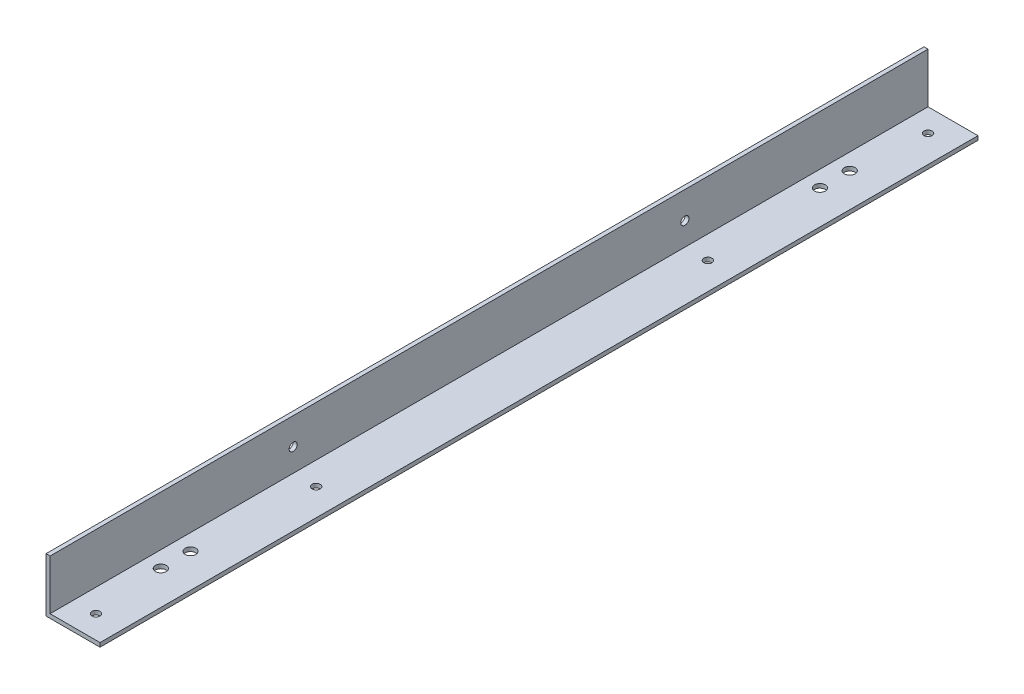
ISO-10303-21;
HEADER;
FILE_DESCRIPTION(('STEP AP214'),'2;1');
FILE_NAME('part.step','',(''),(''),'','','');
FILE_SCHEMA(('AUTOMOTIVE_DESIGN { 1 0 10303 214 1 1 1 1 }'));
ENDSEC;
DATA;
#1=APPLICATION_CONTEXT('core data for automotive mechanical design processes');
#2=APPLICATION_PROTOCOL_DEFINITION('international standard','automotive_design',2000,#1);
#3=PRODUCT_CONTEXT('',#1,'mechanical');
#4=PRODUCT('Part','Part','',(#3));
#5=PRODUCT_RELATED_PRODUCT_CATEGORY('part','',(#4));
#6=PRODUCT_DEFINITION_FORMATION('','',#4);
#7=PRODUCT_DEFINITION_CONTEXT('part definition',#1,'design');
#8=PRODUCT_DEFINITION('design','',#6,#7);
#9=PRODUCT_DEFINITION_SHAPE('','',#8);
#10=(LENGTH_UNIT() NAMED_UNIT(*) SI_UNIT(.MILLI.,.METRE.));
#11=(NAMED_UNIT(*) PLANE_ANGLE_UNIT() SI_UNIT($,.RADIAN.));
#12=(NAMED_UNIT(*) SI_UNIT($,.STERADIAN.) SOLID_ANGLE_UNIT());
#13=UNCERTAINTY_MEASURE_WITH_UNIT(LENGTH_MEASURE(1.E-05),#10,'distance_accuracy_value','');
#14=(GEOMETRIC_REPRESENTATION_CONTEXT(3) GLOBAL_UNCERTAINTY_ASSIGNED_CONTEXT((#13)) GLOBAL_UNIT_ASSIGNED_CONTEXT((#10,
#11,#12)) REPRESENTATION_CONTEXT('',''));
#15=CARTESIAN_POINT('',(0.,0.,0.));
#16=DIRECTION('',(0.,0.,1.));
#17=DIRECTION('',(1.,0.,0.));
#18=AXIS2_PLACEMENT_3D('',#15,#16,#17);
#19=CARTESIAN_POINT('',(-15.9316863798358,4.77336842105263,325.));
#20=DIRECTION('',(0.,-1.,0.));
#21=DIRECTION('',(1.,0.,0.));
#22=AXIS2_PLACEMENT_3D('',#19,#20,#21);
#23=PLANE('',#22);
#24=DIRECTION('',(-1.,0.,0.));
#25=VECTOR('',#24,1.);
#26=CARTESIAN_POINT('',(-15.9316863798358,4.77336842105263,0.));
#27=LINE('',#26,#25);
#28=CARTESIAN_POINT('',(-15.9316863798358,4.77336842105263,0.));
#29=VERTEX_POINT('',#28);
#30=CARTESIAN_POINT('',(-17.4316863798358,4.77336842105263,0.));
#31=VERTEX_POINT('',#30);
#32=EDGE_CURVE('E116',#29,#31,#27,.T.);
#33=ORIENTED_EDGE('',*,*,#32,.T.);
#34=DIRECTION('',(0.,0.,-1.));
#35=VECTOR('',#34,1.);
#36=CARTESIAN_POINT('',(-17.4316863798358,4.77336842105263,325.));
#37=LINE('',#36,#35);
#38=CARTESIAN_POINT('',(-17.4316863798358,4.77336842105263,325.));
#39=VERTEX_POINT('',#38);
#40=EDGE_CURVE('E11',#39,#31,#37,.T.);
#41=ORIENTED_EDGE('',*,*,#40,.F.);
#42=DIRECTION('',(-1.,0.,0.));
#43=VECTOR('',#42,1.);
#44=CARTESIAN_POINT('',(-15.9316863798358,4.77336842105263,325.));
#45=LINE('',#44,#43);
#46=CARTESIAN_POINT('',(-15.9316863798358,4.77336842105263,325.));
#47=VERTEX_POINT('',#46);
#48=EDGE_CURVE('E127',#47,#39,#45,.T.);
#49=ORIENTED_EDGE('',*,*,#48,.F.);
#50=DIRECTION('',(0.,0.,-1.));
#51=VECTOR('',#50,1.);
#52=CARTESIAN_POINT('',(-15.9316863798358,4.77336842105263,325.));
#53=LINE('',#52,#51);
#54=EDGE_CURVE('E112',#47,#29,#53,.T.);
#55=ORIENTED_EDGE('',*,*,#54,.T.);
#56=EDGE_LOOP('',(#33,#41,#49,#55));
#57=FACE_BOUND('',#56,.T.);
#58=ADVANCED_FACE('F30',(#57),#23,.F.);
#59=CARTESIAN_POINT('',(-17.4316863798358,4.77336842105263,325.));
#60=DIRECTION('',(1.,0.,0.));
#61=DIRECTION('',(0.,1.,0.));
#62=AXIS2_PLACEMENT_3D('',#59,#60,#61);
#63=PLANE('',#62);
#64=CARTESIAN_POINT('',(-17.4316863798358,-5.22663157894737,90.));
#65=DIRECTION('',(-1.,0.,0.));
#66=DIRECTION('',(0.,-1.,0.));
#67=AXIS2_PLACEMENT_3D('',#64,#65,#66);
#68=CIRCLE('',#67,1.5);
#69=CARTESIAN_POINT('',(-17.4316863798358,-6.72663157894736,90.));
#70=VERTEX_POINT('',#69);
#71=EDGE_CURVE('E146',#70,#70,#68,.T.);
#72=ORIENTED_EDGE('',*,*,#71,.F.);
#73=EDGE_LOOP('',(#72));
#74=FACE_BOUND('',#73,.T.);
#75=CARTESIAN_POINT('',(-17.4316863798358,-5.22663157894737,235.));
#76=DIRECTION('',(-1.,0.,0.));
#77=DIRECTION('',(0.,-1.,0.));
#78=AXIS2_PLACEMENT_3D('',#75,#76,#77);
#79=CIRCLE('',#78,1.5);
#80=CARTESIAN_POINT('',(-17.4316863798358,-6.72663157894736,235.));
#81=VERTEX_POINT('',#80);
#82=EDGE_CURVE('E135',#81,#81,#79,.T.);
#83=ORIENTED_EDGE('',*,*,#82,.F.);
#84=EDGE_LOOP('',(#83));
#85=FACE_BOUND('',#84,.T.);
#86=DIRECTION('',(0.,-1.,0.));
#87=VECTOR('',#86,1.);
#88=CARTESIAN_POINT('',(-17.4316863798358,4.77336842105263,0.));
#89=LINE('',#88,#87);
#90=CARTESIAN_POINT('',(-17.4316863798357,-15.2266315789474,0.));
#91=VERTEX_POINT('',#90);
#92=EDGE_CURVE('E119',#31,#91,#89,.T.);
#93=ORIENTED_EDGE('',*,*,#92,.T.);
#94=DIRECTION('',(0.,0.,-1.));
#95=VECTOR('',#94,1.);
#96=CARTESIAN_POINT('',(-17.4316863798357,-15.2266315789474,325.));
#97=LINE('',#96,#95);
#98=CARTESIAN_POINT('',(-17.4316863798357,-15.2266315789474,325.));
#99=VERTEX_POINT('',#98);
#100=EDGE_CURVE('E39',#99,#91,#97,.T.);
#101=ORIENTED_EDGE('',*,*,#100,.F.);
#102=DIRECTION('',(0.,-1.,0.));
#103=VECTOR('',#102,1.);
#104=CARTESIAN_POINT('',(-17.4316863798358,4.77336842105263,325.));
#105=LINE('',#104,#103);
#106=EDGE_CURVE('E85',#39,#99,#105,.T.);
#107=ORIENTED_EDGE('',*,*,#106,.F.);
#108=ORIENTED_EDGE('',*,*,#40,.T.);
#109=EDGE_LOOP('',(#93,#101,#107,#108));
#110=FACE_BOUND('',#109,.T.);
#111=ADVANCED_FACE('F195',(#74,#85,#110),#63,.F.);
#112=CARTESIAN_POINT('',(-17.4316863798357,-15.2266315789474,325.));
#113=DIRECTION('',(0.,1.,0.));
#114=DIRECTION('',(0.,0.,1.));
#115=AXIS2_PLACEMENT_3D('',#112,#113,#114);
#116=PLANE('',#115);
#117=CARTESIAN_POINT('',(-7.43168637983575,-15.2266315789474,90.));
#118=DIRECTION('',(0.,1.,0.));
#119=DIRECTION('',(0.,0.,1.));
#120=AXIS2_PLACEMENT_3D('',#117,#118,#119);
#121=CIRCLE('',#120,1.5);
#122=CARTESIAN_POINT('',(-7.43168637983575,-15.2266315789474,91.5));
#123=VERTEX_POINT('',#122);
#124=EDGE_CURVE('E139',#123,#123,#121,.T.);
#125=ORIENTED_EDGE('',*,*,#124,.T.);
#126=EDGE_LOOP('',(#125));
#127=FACE_BOUND('',#126,.T.);
#128=CARTESIAN_POINT('',(-7.43168637983575,-15.2266315789474,235.));
#129=DIRECTION('',(0.,1.,0.));
#130=DIRECTION('',(0.,0.,1.));
#131=AXIS2_PLACEMENT_3D('',#128,#129,#130);
#132=CIRCLE('',#131,1.5);
#133=CARTESIAN_POINT('',(-7.43168637983575,-15.2266315789474,236.5));
#134=VERTEX_POINT('',#133);
#135=EDGE_CURVE('E154',#134,#134,#132,.T.);
#136=ORIENTED_EDGE('',*,*,#135,.T.);
#137=EDGE_LOOP('',(#136));
#138=FACE_BOUND('',#137,.T.);
#139=CARTESIAN_POINT('',(-9.93168637983575,-15.2266315789474,279.));
#140=DIRECTION('',(0.,1.,0.));
#141=DIRECTION('',(0.,0.,1.));
#142=AXIS2_PLACEMENT_3D('',#139,#140,#141);
#143=CIRCLE('',#142,2.);
#144=CARTESIAN_POINT('',(-9.93168637983575,-15.2266315789474,281.));
#145=VERTEX_POINT('',#144);
#146=EDGE_CURVE('E160',#145,#145,#143,.T.);
#147=ORIENTED_EDGE('',*,*,#146,.T.);
#148=EDGE_LOOP('',(#147));
#149=FACE_BOUND('',#148,.T.);
#150=CARTESIAN_POINT('',(-9.93168637983575,-15.2266315789474,290.));
#151=DIRECTION('',(0.,1.,0.));
#152=DIRECTION('',(0.,0.,1.));
#153=AXIS2_PLACEMENT_3D('',#150,#151,#152);
#154=CIRCLE('',#153,2.);
#155=CARTESIAN_POINT('',(-9.93168637983575,-15.2266315789474,292.));
#156=VERTEX_POINT('',#155);
#157=EDGE_CURVE('E166',#156,#156,#154,.T.);
#158=ORIENTED_EDGE('',*,*,#157,.T.);
#159=EDGE_LOOP('',(#158));
#160=FACE_BOUND('',#159,.T.);
#161=CARTESIAN_POINT('',(-9.93168637983575,-15.2266315789474,46.));
#162=DIRECTION('',(0.,1.,0.));
#163=DIRECTION('',(0.,0.,1.));
#164=AXIS2_PLACEMENT_3D('',#161,#162,#163);
#165=CIRCLE('',#164,2.);
#166=CARTESIAN_POINT('',(-9.93168637983575,-15.2266315789474,48.));
#167=VERTEX_POINT('',#166);
#168=EDGE_CURVE('E172',#167,#167,#165,.T.);
#169=ORIENTED_EDGE('',*,*,#168,.T.);
#170=EDGE_LOOP('',(#169));
#171=FACE_BOUND('',#170,.T.);
#172=CARTESIAN_POINT('',(-9.93168637983575,-15.2266315789474,35.));
#173=DIRECTION('',(0.,1.,0.));
#174=DIRECTION('',(0.,0.,1.));
#175=AXIS2_PLACEMENT_3D('',#172,#173,#174);
#176=CIRCLE('',#175,2.);
#177=CARTESIAN_POINT('',(-9.93168637983575,-15.2266315789474,37.));
#178=VERTEX_POINT('',#177);
#179=EDGE_CURVE('E178',#178,#178,#176,.T.);
#180=ORIENTED_EDGE('',*,*,#179,.T.);
#181=EDGE_LOOP('',(#180));
#182=FACE_BOUND('',#181,.T.);
#183=CARTESIAN_POINT('',(-7.43168637983575,-15.2266315789474,316.5));
#184=DIRECTION('',(0.,1.,0.));
#185=DIRECTION('',(0.,0.,1.));
#186=AXIS2_PLACEMENT_3D('',#183,#184,#185);
#187=CIRCLE('',#186,1.5);
#188=CARTESIAN_POINT('',(-7.43168637983575,-15.2266315789474,318.));
#189=VERTEX_POINT('',#188);
#190=EDGE_CURVE('E184',#189,#189,#187,.T.);
#191=ORIENTED_EDGE('',*,*,#190,.T.);
#192=EDGE_LOOP('',(#191));
#193=FACE_BOUND('',#192,.T.);
#194=CARTESIAN_POINT('',(-7.43168637983575,-15.2266315789474,8.50000000000001));
#195=DIRECTION('',(0.,1.,0.));
#196=DIRECTION('',(0.,0.,1.));
#197=AXIS2_PLACEMENT_3D('',#194,#195,#196);
#198=CIRCLE('',#197,1.5);
#199=CARTESIAN_POINT('',(-7.43168637983575,-15.2266315789474,10.));
#200=VERTEX_POINT('',#199);
#201=EDGE_CURVE('E120',#200,#200,#198,.T.);
#202=ORIENTED_EDGE('',*,*,#201,.T.);
#203=EDGE_LOOP('',(#202));
#204=FACE_BOUND('',#203,.T.);
#205=DIRECTION('',(1.,0.,0.));
#206=VECTOR('',#205,1.);
#207=CARTESIAN_POINT('',(-17.4316863798357,-15.2266315789474,0.));
#208=LINE('',#207,#206);
#209=CARTESIAN_POINT('',(2.56831362016425,-15.2266315789474,0.));
#210=VERTEX_POINT('',#209);
#211=EDGE_CURVE('E122',#91,#210,#208,.T.);
#212=ORIENTED_EDGE('',*,*,#211,.T.);
#213=DIRECTION('',(0.,0.,-1.));
#214=VECTOR('',#213,1.);
#215=CARTESIAN_POINT('',(2.56831362016425,-15.2266315789474,325.));
#216=LINE('',#215,#214);
#217=CARTESIAN_POINT('',(2.56831362016425,-15.2266315789474,325.));
#218=VERTEX_POINT('',#217);
#219=EDGE_CURVE('E107',#218,#210,#216,.T.);
#220=ORIENTED_EDGE('',*,*,#219,.F.);
#221=DIRECTION('',(1.,0.,0.));
#222=VECTOR('',#221,1.);
#223=CARTESIAN_POINT('',(-17.4316863798357,-15.2266315789474,325.));
#224=LINE('',#223,#222);
#225=EDGE_CURVE('E98',#99,#218,#224,.T.);
#226=ORIENTED_EDGE('',*,*,#225,.F.);
#227=ORIENTED_EDGE('',*,*,#100,.T.);
#228=EDGE_LOOP('',(#212,#220,#226,#227));
#229=FACE_BOUND('',#228,.T.);
#230=ADVANCED_FACE('F198',(#127,#138,#149,#160,#171,#182,#193,#204,#229),#116,.F.);
#231=CARTESIAN_POINT('',(2.56831362016425,-15.2266315789474,325.));
#232=DIRECTION('',(-1.,0.,0.));
#233=DIRECTION('',(0.,0.,1.));
#234=AXIS2_PLACEMENT_3D('',#231,#232,#233);
#235=PLANE('',#234);
#236=DIRECTION('',(0.,1.,0.));
#237=VECTOR('',#236,1.);
#238=CARTESIAN_POINT('',(2.56831362016425,-15.2266315789474,0.));
#239=LINE('',#238,#237);
#240=CARTESIAN_POINT('',(2.56831362016425,-13.7266315789474,0.));
#241=VERTEX_POINT('',#240);
#242=EDGE_CURVE('E106',#210,#241,#239,.T.);
#243=ORIENTED_EDGE('',*,*,#242,.T.);
#244=DIRECTION('',(0.,0.,-1.));
#245=VECTOR('',#244,1.);
#246=CARTESIAN_POINT('',(2.56831362016425,-13.7266315789474,325.));
#247=LINE('',#246,#245);
#248=CARTESIAN_POINT('',(2.56831362016425,-13.7266315789474,325.));
#249=VERTEX_POINT('',#248);
#250=EDGE_CURVE('E103',#249,#241,#247,.T.);
#251=ORIENTED_EDGE('',*,*,#250,.F.);
#252=DIRECTION('',(0.,1.,0.));
#253=VECTOR('',#252,1.);
#254=CARTESIAN_POINT('',(2.56831362016425,-15.2266315789474,325.));
#255=LINE('',#254,#253);
#256=EDGE_CURVE('E92',#218,#249,#255,.T.);
#257=ORIENTED_EDGE('',*,*,#256,.F.);
#258=ORIENTED_EDGE('',*,*,#219,.T.);
#259=EDGE_LOOP('',(#243,#251,#257,#258));
#260=FACE_BOUND('',#259,.T.);
#261=ADVANCED_FACE('F104',(#260),#235,.F.);
#262=CARTESIAN_POINT('',(2.56831362016425,-13.7266315789474,325.));
#263=DIRECTION('',(0.,-1.,0.));
#264=DIRECTION('',(1.,0.,0.));
#265=AXIS2_PLACEMENT_3D('',#262,#263,#264);
#266=PLANE('',#265);
#267=CARTESIAN_POINT('',(-7.43168637983575,-13.7266315789474,90.));
#268=DIRECTION('',(0.,1.,0.));
#269=DIRECTION('',(-1.,0.,0.));
#270=AXIS2_PLACEMENT_3D('',#267,#268,#269);
#271=CIRCLE('',#270,1.5);
#272=CARTESIAN_POINT('',(-8.93168637983575,-13.7266315789474,90.));
#273=VERTEX_POINT('',#272);
#274=EDGE_CURVE('E134',#273,#273,#271,.T.);
#275=ORIENTED_EDGE('',*,*,#274,.F.);
#276=EDGE_LOOP('',(#275));
#277=FACE_BOUND('',#276,.T.);
#278=CARTESIAN_POINT('',(-7.43168637983575,-13.7266315789474,235.));
#279=DIRECTION('',(0.,1.,0.));
#280=DIRECTION('',(-1.,0.,0.));
#281=AXIS2_PLACEMENT_3D('',#278,#279,#280);
#282=CIRCLE('',#281,1.5);
#283=CARTESIAN_POINT('',(-8.93168637983575,-13.7266315789474,235.));
#284=VERTEX_POINT('',#283);
#285=EDGE_CURVE('E151',#284,#284,#282,.T.);
#286=ORIENTED_EDGE('',*,*,#285,.F.);
#287=EDGE_LOOP('',(#286));
#288=FACE_BOUND('',#287,.T.);
#289=CARTESIAN_POINT('',(-9.93168637983575,-13.7266315789474,279.));
#290=DIRECTION('',(0.,1.,0.));
#291=DIRECTION('',(-1.,0.,0.));
#292=AXIS2_PLACEMENT_3D('',#289,#290,#291);
#293=CIRCLE('',#292,2.);
#294=CARTESIAN_POINT('',(-11.9316863798358,-13.7266315789474,279.));
#295=VERTEX_POINT('',#294);
#296=EDGE_CURVE('E157',#295,#295,#293,.T.);
#297=ORIENTED_EDGE('',*,*,#296,.F.);
#298=EDGE_LOOP('',(#297));
#299=FACE_BOUND('',#298,.T.);
#300=CARTESIAN_POINT('',(-9.93168637983575,-13.7266315789474,290.));
#301=DIRECTION('',(0.,1.,0.));
#302=DIRECTION('',(-1.,0.,0.));
#303=AXIS2_PLACEMENT_3D('',#300,#301,#302);
#304=CIRCLE('',#303,2.);
#305=CARTESIAN_POINT('',(-11.9316863798358,-13.7266315789474,290.));
#306=VERTEX_POINT('',#305);
#307=EDGE_CURVE('E163',#306,#306,#304,.T.);
#308=ORIENTED_EDGE('',*,*,#307,.F.);
#309=EDGE_LOOP('',(#308));
#310=FACE_BOUND('',#309,.T.);
#311=CARTESIAN_POINT('',(-9.93168637983575,-13.7266315789474,46.));
#312=DIRECTION('',(0.,1.,0.));
#313=DIRECTION('',(-1.,0.,0.));
#314=AXIS2_PLACEMENT_3D('',#311,#312,#313);
#315=CIRCLE('',#314,2.);
#316=CARTESIAN_POINT('',(-11.9316863798358,-13.7266315789474,46.));
#317=VERTEX_POINT('',#316);
#318=EDGE_CURVE('E169',#317,#317,#315,.T.);
#319=ORIENTED_EDGE('',*,*,#318,.F.);
#320=EDGE_LOOP('',(#319));
#321=FACE_BOUND('',#320,.T.);
#322=CARTESIAN_POINT('',(-9.93168637983575,-13.7266315789474,35.));
#323=DIRECTION('',(0.,1.,0.));
#324=DIRECTION('',(-1.,0.,0.));
#325=AXIS2_PLACEMENT_3D('',#322,#323,#324);
#326=CIRCLE('',#325,2.);
#327=CARTESIAN_POINT('',(-11.9316863798358,-13.7266315789474,35.));
#328=VERTEX_POINT('',#327);
#329=EDGE_CURVE('E175',#328,#328,#326,.T.);
#330=ORIENTED_EDGE('',*,*,#329,.F.);
#331=EDGE_LOOP('',(#330));
#332=FACE_BOUND('',#331,.T.);
#333=CARTESIAN_POINT('',(-7.43168637983575,-13.7266315789474,316.5));
#334=DIRECTION('',(0.,1.,0.));
#335=DIRECTION('',(-1.,0.,0.));
#336=AXIS2_PLACEMENT_3D('',#333,#334,#335);
#337=CIRCLE('',#336,1.5);
#338=CARTESIAN_POINT('',(-8.93168637983575,-13.7266315789474,316.5));
#339=VERTEX_POINT('',#338);
#340=EDGE_CURVE('E181',#339,#339,#337,.T.);
#341=ORIENTED_EDGE('',*,*,#340,.F.);
#342=EDGE_LOOP('',(#341));
#343=FACE_BOUND('',#342,.T.);
#344=CARTESIAN_POINT('',(-7.43168637983575,-13.7266315789474,8.50000000000001));
#345=DIRECTION('',(0.,1.,0.));
#346=DIRECTION('',(-1.,0.,0.));
#347=AXIS2_PLACEMENT_3D('',#344,#345,#346);
#348=CIRCLE('',#347,1.5);
#349=CARTESIAN_POINT('',(-8.93168637983575,-13.7266315789474,8.50000000000001));
#350=VERTEX_POINT('',#349);
#351=EDGE_CURVE('E187',#350,#350,#348,.T.);
#352=ORIENTED_EDGE('',*,*,#351,.F.);
#353=EDGE_LOOP('',(#352));
#354=FACE_BOUND('',#353,.T.);
#355=DIRECTION('',(-1.,0.,0.));
#356=VECTOR('',#355,1.);
#357=CARTESIAN_POINT('',(2.56831362016425,-13.7266315789474,0.));
#358=LINE('',#357,#356);
#359=CARTESIAN_POINT('',(-15.9316863798358,-13.7266315789474,0.));
#360=VERTEX_POINT('',#359);
#361=EDGE_CURVE('E71',#241,#360,#358,.T.);
#362=ORIENTED_EDGE('',*,*,#361,.T.);
#363=DIRECTION('',(0.,0.,-1.));
#364=VECTOR('',#363,1.);
#365=CARTESIAN_POINT('',(-15.9316863798358,-13.7266315789474,325.));
#366=LINE('',#365,#364);
#367=CARTESIAN_POINT('',(-15.9316863798358,-13.7266315789474,325.));
#368=VERTEX_POINT('',#367);
#369=EDGE_CURVE('E108',#368,#360,#366,.T.);
#370=ORIENTED_EDGE('',*,*,#369,.F.);
#371=DIRECTION('',(-1.,0.,0.));
#372=VECTOR('',#371,1.);
#373=CARTESIAN_POINT('',(2.56831362016425,-13.7266315789474,325.));
#374=LINE('',#373,#372);
#375=EDGE_CURVE('E96',#249,#368,#374,.T.);
#376=ORIENTED_EDGE('',*,*,#375,.F.);
#377=ORIENTED_EDGE('',*,*,#250,.T.);
#378=EDGE_LOOP('',(#362,#370,#376,#377));
#379=FACE_BOUND('',#378,.T.);
#380=ADVANCED_FACE('F110',(#277,#288,#299,#310,#321,#332,#343,#354,#379),#266,.F.);
#381=CARTESIAN_POINT('',(-15.9316863798358,-13.7266315789474,325.));
#382=DIRECTION('',(-1.,0.,0.));
#383=DIRECTION('',(0.,0.,1.));
#384=AXIS2_PLACEMENT_3D('',#381,#382,#383);
#385=PLANE('',#384);
#386=CARTESIAN_POINT('',(-15.9316863798358,-5.22663157894737,90.));
#387=DIRECTION('',(-1.,0.,0.));
#388=DIRECTION('',(0.,0.,1.));
#389=AXIS2_PLACEMENT_3D('',#386,#387,#388);
#390=CIRCLE('',#389,1.5);
#391=CARTESIAN_POINT('',(-15.9316863798358,-5.22663157894737,91.5));
#392=VERTEX_POINT('',#391);
#393=EDGE_CURVE('E33',#392,#392,#390,.T.);
#394=ORIENTED_EDGE('',*,*,#393,.T.);
#395=EDGE_LOOP('',(#394));
#396=FACE_BOUND('',#395,.T.);
#397=CARTESIAN_POINT('',(-15.9316863798358,-5.22663157894737,235.));
#398=DIRECTION('',(-1.,0.,0.));
#399=DIRECTION('',(0.,0.,1.));
#400=AXIS2_PLACEMENT_3D('',#397,#398,#399);
#401=CIRCLE('',#400,1.5);
#402=CARTESIAN_POINT('',(-15.9316863798358,-5.22663157894737,236.5));
#403=VERTEX_POINT('',#402);
#404=EDGE_CURVE('E132',#403,#403,#401,.T.);
#405=ORIENTED_EDGE('',*,*,#404,.T.);
#406=EDGE_LOOP('',(#405));
#407=FACE_BOUND('',#406,.T.);
#408=DIRECTION('',(0.,1.,0.));
#409=VECTOR('',#408,1.);
#410=CARTESIAN_POINT('',(-15.9316863798358,-13.7266315789474,0.));
#411=LINE('',#410,#409);
#412=EDGE_CURVE('E77',#360,#29,#411,.T.);
#413=ORIENTED_EDGE('',*,*,#412,.T.);
#414=ORIENTED_EDGE('',*,*,#54,.F.);
#415=DIRECTION('',(0.,1.,0.));
#416=VECTOR('',#415,1.);
#417=CARTESIAN_POINT('',(-15.9316863798358,-13.7266315789474,325.));
#418=LINE('',#417,#416);
#419=EDGE_CURVE('E48',#368,#47,#418,.T.);
#420=ORIENTED_EDGE('',*,*,#419,.F.);
#421=ORIENTED_EDGE('',*,*,#369,.T.);
#422=EDGE_LOOP('',(#413,#414,#420,#421));
#423=FACE_BOUND('',#422,.T.);
#424=ADVANCED_FACE('F203',(#396,#407,#423),#385,.F.);
#425=CARTESIAN_POINT('',(-17.4316863798358,4.77336842105263,325.));
#426=DIRECTION('',(0.,0.,1.));
#427=DIRECTION('',(1.,0.,0.));
#428=AXIS2_PLACEMENT_3D('',#425,#426,#427);
#429=PLANE('',#428);
#430=ORIENTED_EDGE('',*,*,#48,.T.);
#431=ORIENTED_EDGE('',*,*,#106,.T.);
#432=ORIENTED_EDGE('',*,*,#225,.T.);
#433=ORIENTED_EDGE('',*,*,#256,.T.);
#434=ORIENTED_EDGE('',*,*,#375,.T.);
#435=ORIENTED_EDGE('',*,*,#419,.T.);
#436=EDGE_LOOP('',(#430,#431,#432,#433,#434,#435));
#437=FACE_BOUND('',#436,.T.);
#438=ADVANCED_FACE('F94',(#437),#429,.T.);
#439=CARTESIAN_POINT('',(-17.4316863798358,4.77336842105263,0.));
#440=DIRECTION('',(0.,0.,1.));
#441=DIRECTION('',(1.,0.,0.));
#442=AXIS2_PLACEMENT_3D('',#439,#440,#441);
#443=PLANE('',#442);
#444=ORIENTED_EDGE('',*,*,#32,.F.);
#445=ORIENTED_EDGE('',*,*,#412,.F.);
#446=ORIENTED_EDGE('',*,*,#361,.F.);
#447=ORIENTED_EDGE('',*,*,#242,.F.);
#448=ORIENTED_EDGE('',*,*,#211,.F.);
#449=ORIENTED_EDGE('',*,*,#92,.F.);
#450=EDGE_LOOP('',(#444,#445,#446,#447,#448,#449));
#451=FACE_BOUND('',#450,.T.);
#452=ADVANCED_FACE('F201',(#451),#443,.F.);
#453=CARTESIAN_POINT('',(-7.43168637983563,-313.726631578947,8.50000000000001));
#454=DIRECTION('',(0.,1.,0.));
#455=DIRECTION('',(-1.,0.,0.));
#456=AXIS2_PLACEMENT_3D('',#453,#454,#455);
#457=CYLINDRICAL_SURFACE('',#456,1.5);
#458=ORIENTED_EDGE('',*,*,#351,.T.);
#459=EDGE_LOOP('',(#458));
#460=FACE_BOUND('',#459,.T.);
#461=ORIENTED_EDGE('',*,*,#201,.F.);
#462=EDGE_LOOP('',(#461));
#463=FACE_BOUND('',#462,.T.);
#464=ADVANCED_FACE('F254',(#460,#463),#457,.F.);
#465=CARTESIAN_POINT('',(-7.43168637983563,-313.726631578947,316.5));
#466=DIRECTION('',(0.,1.,0.));
#467=DIRECTION('',(-1.,0.,0.));
#468=AXIS2_PLACEMENT_3D('',#465,#466,#467);
#469=CYLINDRICAL_SURFACE('',#468,1.5);
#470=ORIENTED_EDGE('',*,*,#340,.T.);
#471=EDGE_LOOP('',(#470));
#472=FACE_BOUND('',#471,.T.);
#473=ORIENTED_EDGE('',*,*,#190,.F.);
#474=EDGE_LOOP('',(#473));
#475=FACE_BOUND('',#474,.T.);
#476=ADVANCED_FACE('F259',(#472,#475),#469,.F.);
#477=CARTESIAN_POINT('',(-9.93168637983564,-313.726631578947,35.));
#478=DIRECTION('',(0.,1.,0.));
#479=DIRECTION('',(-1.,0.,0.));
#480=AXIS2_PLACEMENT_3D('',#477,#478,#479);
#481=CYLINDRICAL_SURFACE('',#480,2.);
#482=ORIENTED_EDGE('',*,*,#329,.T.);
#483=EDGE_LOOP('',(#482));
#484=FACE_BOUND('',#483,.T.);
#485=ORIENTED_EDGE('',*,*,#179,.F.);
#486=EDGE_LOOP('',(#485));
#487=FACE_BOUND('',#486,.T.);
#488=ADVANCED_FACE('F267',(#484,#487),#481,.F.);
#489=CARTESIAN_POINT('',(-9.93168637983564,-313.726631578947,46.));
#490=DIRECTION('',(0.,1.,0.));
#491=DIRECTION('',(-1.,0.,0.));
#492=AXIS2_PLACEMENT_3D('',#489,#490,#491);
#493=CYLINDRICAL_SURFACE('',#492,2.);
#494=ORIENTED_EDGE('',*,*,#318,.T.);
#495=EDGE_LOOP('',(#494));
#496=FACE_BOUND('',#495,.T.);
#497=ORIENTED_EDGE('',*,*,#168,.F.);
#498=EDGE_LOOP('',(#497));
#499=FACE_BOUND('',#498,.T.);
#500=ADVANCED_FACE('F275',(#496,#499),#493,.F.);
#501=CARTESIAN_POINT('',(-9.93168637983564,-313.726631578947,290.));
#502=DIRECTION('',(0.,1.,0.));
#503=DIRECTION('',(-1.,0.,0.));
#504=AXIS2_PLACEMENT_3D('',#501,#502,#503);
#505=CYLINDRICAL_SURFACE('',#504,2.);
#506=ORIENTED_EDGE('',*,*,#307,.T.);
#507=EDGE_LOOP('',(#506));
#508=FACE_BOUND('',#507,.T.);
#509=ORIENTED_EDGE('',*,*,#157,.F.);
#510=EDGE_LOOP('',(#509));
#511=FACE_BOUND('',#510,.T.);
#512=ADVANCED_FACE('F283',(#508,#511),#505,.F.);
#513=CARTESIAN_POINT('',(-9.93168637983564,-313.726631578947,279.));
#514=DIRECTION('',(0.,1.,0.));
#515=DIRECTION('',(-1.,0.,0.));
#516=AXIS2_PLACEMENT_3D('',#513,#514,#515);
#517=CYLINDRICAL_SURFACE('',#516,2.);
#518=ORIENTED_EDGE('',*,*,#296,.T.);
#519=EDGE_LOOP('',(#518));
#520=FACE_BOUND('',#519,.T.);
#521=ORIENTED_EDGE('',*,*,#146,.F.);
#522=EDGE_LOOP('',(#521));
#523=FACE_BOUND('',#522,.T.);
#524=ADVANCED_FACE('F291',(#520,#523),#517,.F.);
#525=CARTESIAN_POINT('',(-7.43168637983563,-313.726631578947,235.));
#526=DIRECTION('',(0.,1.,0.));
#527=DIRECTION('',(-1.,0.,0.));
#528=AXIS2_PLACEMENT_3D('',#525,#526,#527);
#529=CYLINDRICAL_SURFACE('',#528,1.5);
#530=ORIENTED_EDGE('',*,*,#285,.T.);
#531=EDGE_LOOP('',(#530));
#532=FACE_BOUND('',#531,.T.);
#533=ORIENTED_EDGE('',*,*,#135,.F.);
#534=EDGE_LOOP('',(#533));
#535=FACE_BOUND('',#534,.T.);
#536=ADVANCED_FACE('F299',(#532,#535),#529,.F.);
#537=CARTESIAN_POINT('',(-7.43168637983563,-313.726631578947,90.));
#538=DIRECTION('',(0.,1.,0.));
#539=DIRECTION('',(-1.,0.,0.));
#540=AXIS2_PLACEMENT_3D('',#537,#538,#539);
#541=CYLINDRICAL_SURFACE('',#540,1.5);
#542=ORIENTED_EDGE('',*,*,#274,.T.);
#543=EDGE_LOOP('',(#542));
#544=FACE_BOUND('',#543,.T.);
#545=ORIENTED_EDGE('',*,*,#124,.F.);
#546=EDGE_LOOP('',(#545));
#547=FACE_BOUND('',#546,.T.);
#548=ADVANCED_FACE('F307',(#544,#547),#541,.F.);
#549=CARTESIAN_POINT('',(-7.43168637983575,-5.22663157894736,235.));
#550=DIRECTION('',(-1.,0.,0.));
#551=DIRECTION('',(0.,-1.,0.));
#552=AXIS2_PLACEMENT_3D('',#549,#550,#551);
#553=CYLINDRICAL_SURFACE('',#552,1.5);
#554=ORIENTED_EDGE('',*,*,#82,.T.);
#555=EDGE_LOOP('',(#554));
#556=FACE_BOUND('',#555,.T.);
#557=ORIENTED_EDGE('',*,*,#404,.F.);
#558=EDGE_LOOP('',(#557));
#559=FACE_BOUND('',#558,.T.);
#560=ADVANCED_FACE('F314',(#556,#559),#553,.F.);
#561=CARTESIAN_POINT('',(-7.43168637983575,-5.22663157894736,90.));
#562=DIRECTION('',(-1.,0.,0.));
#563=DIRECTION('',(0.,-1.,0.));
#564=AXIS2_PLACEMENT_3D('',#561,#562,#563);
#565=CYLINDRICAL_SURFACE('',#564,1.5);
#566=ORIENTED_EDGE('',*,*,#71,.T.);
#567=EDGE_LOOP('',(#566));
#568=FACE_BOUND('',#567,.T.);
#569=ORIENTED_EDGE('',*,*,#393,.F.);
#570=EDGE_LOOP('',(#569));
#571=FACE_BOUND('',#570,.T.);
#572=ADVANCED_FACE('F321',(#568,#571),#565,.F.);
#573=CLOSED_SHELL('',(#58,#111,#230,#261,#380,#424,#438,#452,#464,#476,#488,#500,#512,#524,#536,
#548,#560,#572));
#574=MANIFOLD_SOLID_BREP('B2',#573);
#575=ADVANCED_BREP_SHAPE_REPRESENTATION('',(#18,#574),#14);
#576=SHAPE_DEFINITION_REPRESENTATION(#9,#575);
ENDSEC;
END-ISO-10303-21;
